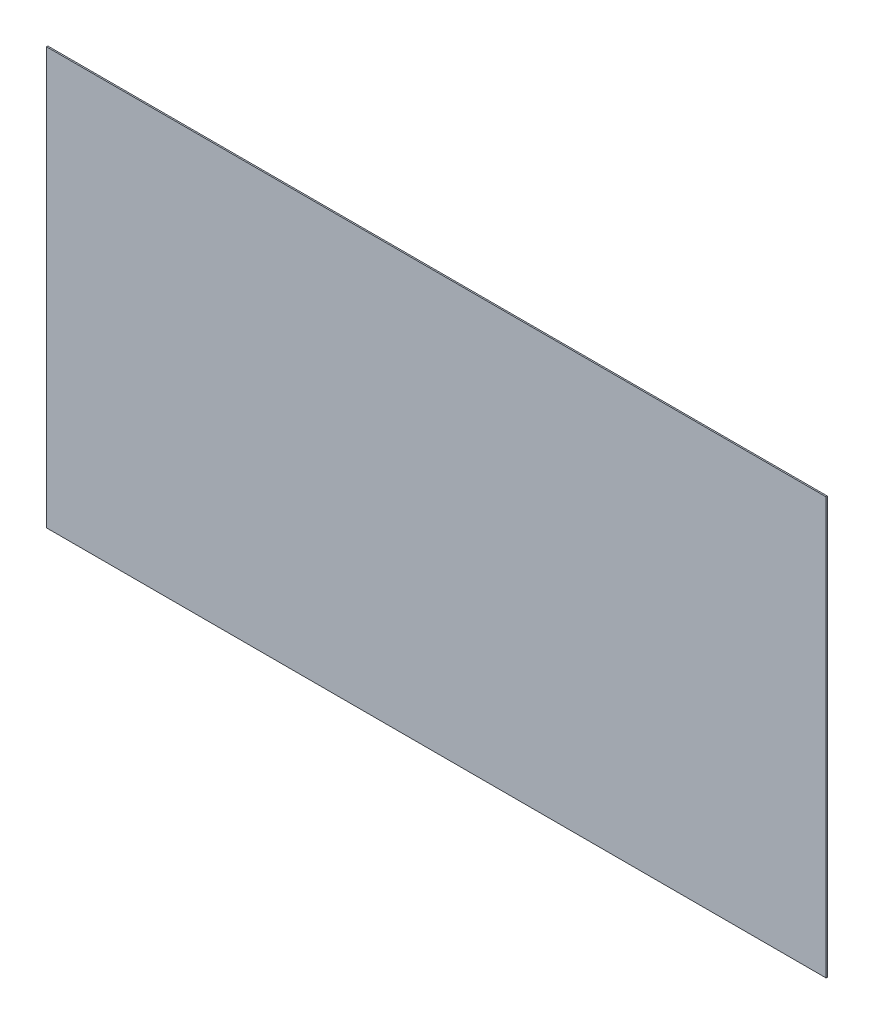
ISO-10303-21;
HEADER;
FILE_DESCRIPTION(('STEP AP214'),'2;1');
FILE_NAME('part.step','',(''),(''),'','','');
FILE_SCHEMA(('AUTOMOTIVE_DESIGN { 1 0 10303 214 1 1 1 1 }'));
ENDSEC;
DATA;
#1=APPLICATION_CONTEXT('core data for automotive mechanical design processes');
#2=APPLICATION_PROTOCOL_DEFINITION('international standard','automotive_design',2000,#1);
#3=PRODUCT_CONTEXT('',#1,'mechanical');
#4=PRODUCT('Part','Part','',(#3));
#5=PRODUCT_RELATED_PRODUCT_CATEGORY('part','',(#4));
#6=PRODUCT_DEFINITION_FORMATION('','',#4);
#7=PRODUCT_DEFINITION_CONTEXT('part definition',#1,'design');
#8=PRODUCT_DEFINITION('design','',#6,#7);
#9=PRODUCT_DEFINITION_SHAPE('','',#8);
#10=(LENGTH_UNIT() NAMED_UNIT(*) SI_UNIT(.MILLI.,.METRE.));
#11=(NAMED_UNIT(*) PLANE_ANGLE_UNIT() SI_UNIT($,.RADIAN.));
#12=(NAMED_UNIT(*) SI_UNIT($,.STERADIAN.) SOLID_ANGLE_UNIT());
#13=UNCERTAINTY_MEASURE_WITH_UNIT(LENGTH_MEASURE(1.E-05),#10,'distance_accuracy_value','');
#14=(GEOMETRIC_REPRESENTATION_CONTEXT(3) GLOBAL_UNCERTAINTY_ASSIGNED_CONTEXT((#13)) GLOBAL_UNIT_ASSIGNED_CONTEXT((#10,
#11,#12)) REPRESENTATION_CONTEXT('',''));
#15=CARTESIAN_POINT('',(0.,0.,0.));
#16=DIRECTION('',(0.,0.,1.));
#17=DIRECTION('',(1.,0.,0.));
#18=AXIS2_PLACEMENT_3D('',#15,#16,#17);
#19=CARTESIAN_POINT('',(290.,-500.,326.410196624969));
#20=DIRECTION('',(-1.,0.,0.));
#21=DIRECTION('',(0.,-1.,0.));
#22=AXIS2_PLACEMENT_3D('',#19,#20,#21);
#23=PLANE('',#22);
#24=DIRECTION('',(0.,1.,0.));
#25=VECTOR('',#24,1.);
#26=CARTESIAN_POINT('',(290.,-500.,325.410196624969));
#27=LINE('',#26,#25);
#28=CARTESIAN_POINT('',(290.,-500.,325.410196624969));
#29=VERTEX_POINT('',#28);
#30=CARTESIAN_POINT('',(290.,-190.,325.410196624969));
#31=VERTEX_POINT('',#30);
#32=EDGE_CURVE('E102',#29,#31,#27,.T.);
#33=ORIENTED_EDGE('',*,*,#32,.T.);
#34=DIRECTION('',(0.,0.,-1.));
#35=VECTOR('',#34,1.);
#36=CARTESIAN_POINT('',(290.,-190.,326.410196624969));
#37=LINE('',#36,#35);
#38=CARTESIAN_POINT('',(290.,-190.,326.410196624969));
#39=VERTEX_POINT('',#38);
#40=EDGE_CURVE('E11',#39,#31,#37,.T.);
#41=ORIENTED_EDGE('',*,*,#40,.F.);
#42=DIRECTION('',(0.,1.,0.));
#43=VECTOR('',#42,1.);
#44=CARTESIAN_POINT('',(290.,-500.,326.410196624969));
#45=LINE('',#44,#43);
#46=CARTESIAN_POINT('',(290.,-500.,326.410196624969));
#47=VERTEX_POINT('',#46);
#48=EDGE_CURVE('E90',#47,#39,#45,.T.);
#49=ORIENTED_EDGE('',*,*,#48,.F.);
#50=DIRECTION('',(0.,0.,-1.));
#51=VECTOR('',#50,1.);
#52=CARTESIAN_POINT('',(290.,-500.,326.410196624969));
#53=LINE('',#52,#51);
#54=EDGE_CURVE('E98',#47,#29,#53,.T.);
#55=ORIENTED_EDGE('',*,*,#54,.T.);
#56=EDGE_LOOP('',(#33,#41,#49,#55));
#57=FACE_BOUND('',#56,.T.);
#58=ADVANCED_FACE('F39',(#57),#23,.F.);
#59=CARTESIAN_POINT('',(290.,-190.,326.410196624969));
#60=DIRECTION('',(0.,-1.,0.));
#61=DIRECTION('',(1.,0.,0.));
#62=AXIS2_PLACEMENT_3D('',#59,#60,#61);
#63=PLANE('',#62);
#64=DIRECTION('',(-1.,0.,0.));
#65=VECTOR('',#64,1.);
#66=CARTESIAN_POINT('',(290.,-190.,325.410196624969));
#67=LINE('',#66,#65);
#68=CARTESIAN_POINT('',(-290.,-190.,325.410196624969));
#69=VERTEX_POINT('',#68);
#70=EDGE_CURVE('E94',#31,#69,#67,.T.);
#71=ORIENTED_EDGE('',*,*,#70,.T.);
#72=DIRECTION('',(0.,0.,-1.));
#73=VECTOR('',#72,1.);
#74=CARTESIAN_POINT('',(-290.,-190.,326.410196624969));
#75=LINE('',#74,#73);
#76=CARTESIAN_POINT('',(-290.,-190.,326.410196624969));
#77=VERTEX_POINT('',#76);
#78=EDGE_CURVE('E47',#77,#69,#75,.T.);
#79=ORIENTED_EDGE('',*,*,#78,.F.);
#80=DIRECTION('',(-1.,0.,0.));
#81=VECTOR('',#80,1.);
#82=CARTESIAN_POINT('',(290.,-190.,326.410196624969));
#83=LINE('',#82,#81);
#84=EDGE_CURVE('E85',#39,#77,#83,.T.);
#85=ORIENTED_EDGE('',*,*,#84,.F.);
#86=ORIENTED_EDGE('',*,*,#40,.T.);
#87=EDGE_LOOP('',(#71,#79,#85,#86));
#88=FACE_BOUND('',#87,.T.);
#89=ADVANCED_FACE('F93',(#88),#63,.F.);
#90=CARTESIAN_POINT('',(-290.,-190.,326.410196624969));
#91=DIRECTION('',(1.,0.,0.));
#92=DIRECTION('',(0.,1.,0.));
#93=AXIS2_PLACEMENT_3D('',#90,#91,#92);
#94=PLANE('',#93);
#95=DIRECTION('',(0.,-1.,0.));
#96=VECTOR('',#95,1.);
#97=CARTESIAN_POINT('',(-290.,-190.,325.410196624969));
#98=LINE('',#97,#96);
#99=CARTESIAN_POINT('',(-290.,-500.,325.410196624969));
#100=VERTEX_POINT('',#99);
#101=EDGE_CURVE('E72',#69,#100,#98,.T.);
#102=ORIENTED_EDGE('',*,*,#101,.T.);
#103=DIRECTION('',(0.,0.,-1.));
#104=VECTOR('',#103,1.);
#105=CARTESIAN_POINT('',(-290.,-500.,326.410196624969));
#106=LINE('',#105,#104);
#107=CARTESIAN_POINT('',(-290.,-500.,326.410196624969));
#108=VERTEX_POINT('',#107);
#109=EDGE_CURVE('E95',#108,#100,#106,.T.);
#110=ORIENTED_EDGE('',*,*,#109,.F.);
#111=DIRECTION('',(0.,-1.,0.));
#112=VECTOR('',#111,1.);
#113=CARTESIAN_POINT('',(-290.,-190.,326.410196624969));
#114=LINE('',#113,#112);
#115=EDGE_CURVE('E88',#77,#108,#114,.T.);
#116=ORIENTED_EDGE('',*,*,#115,.F.);
#117=ORIENTED_EDGE('',*,*,#78,.T.);
#118=EDGE_LOOP('',(#102,#110,#116,#117));
#119=FACE_BOUND('',#118,.T.);
#120=ADVANCED_FACE('F96',(#119),#94,.F.);
#121=CARTESIAN_POINT('',(-290.,-500.,326.410196624969));
#122=DIRECTION('',(0.,1.,0.));
#123=DIRECTION('',(-1.,0.,0.));
#124=AXIS2_PLACEMENT_3D('',#121,#122,#123);
#125=PLANE('',#124);
#126=DIRECTION('',(1.,0.,0.));
#127=VECTOR('',#126,1.);
#128=CARTESIAN_POINT('',(-290.,-500.,325.410196624969));
#129=LINE('',#128,#127);
#130=EDGE_CURVE('E78',#100,#29,#129,.T.);
#131=ORIENTED_EDGE('',*,*,#130,.T.);
#132=ORIENTED_EDGE('',*,*,#54,.F.);
#133=DIRECTION('',(1.,0.,0.));
#134=VECTOR('',#133,1.);
#135=CARTESIAN_POINT('',(-290.,-500.,326.410196624969));
#136=LINE('',#135,#134);
#137=EDGE_CURVE('E55',#108,#47,#136,.T.);
#138=ORIENTED_EDGE('',*,*,#137,.F.);
#139=ORIENTED_EDGE('',*,*,#109,.T.);
#140=EDGE_LOOP('',(#131,#132,#138,#139));
#141=FACE_BOUND('',#140,.T.);
#142=ADVANCED_FACE('F109',(#141),#125,.F.);
#143=CARTESIAN_POINT('',(0.,0.,326.410196624969));
#144=DIRECTION('',(0.,0.,1.));
#145=DIRECTION('',(1.,0.,0.));
#146=AXIS2_PLACEMENT_3D('',#143,#144,#145);
#147=PLANE('',#146);
#148=ORIENTED_EDGE('',*,*,#48,.T.);
#149=ORIENTED_EDGE('',*,*,#84,.T.);
#150=ORIENTED_EDGE('',*,*,#115,.T.);
#151=ORIENTED_EDGE('',*,*,#137,.T.);
#152=EDGE_LOOP('',(#148,#149,#150,#151));
#153=FACE_BOUND('',#152,.T.);
#154=ADVANCED_FACE('F86',(#153),#147,.T.);
#155=CARTESIAN_POINT('',(0.,0.,325.410196624969));
#156=DIRECTION('',(0.,0.,1.));
#157=DIRECTION('',(1.,0.,0.));
#158=AXIS2_PLACEMENT_3D('',#155,#156,#157);
#159=PLANE('',#158);
#160=ORIENTED_EDGE('',*,*,#32,.F.);
#161=ORIENTED_EDGE('',*,*,#130,.F.);
#162=ORIENTED_EDGE('',*,*,#101,.F.);
#163=ORIENTED_EDGE('',*,*,#70,.F.);
#164=EDGE_LOOP('',(#160,#161,#162,#163));
#165=FACE_BOUND('',#164,.T.);
#166=ADVANCED_FACE('F112',(#165),#159,.F.);
#167=CLOSED_SHELL('',(#58,#89,#120,#142,#154,#166));
#168=MANIFOLD_SOLID_BREP('B2',#167);
#169=ADVANCED_BREP_SHAPE_REPRESENTATION('',(#18,#168),#14);
#170=SHAPE_DEFINITION_REPRESENTATION(#9,#169);
ENDSEC;
END-ISO-10303-21;
